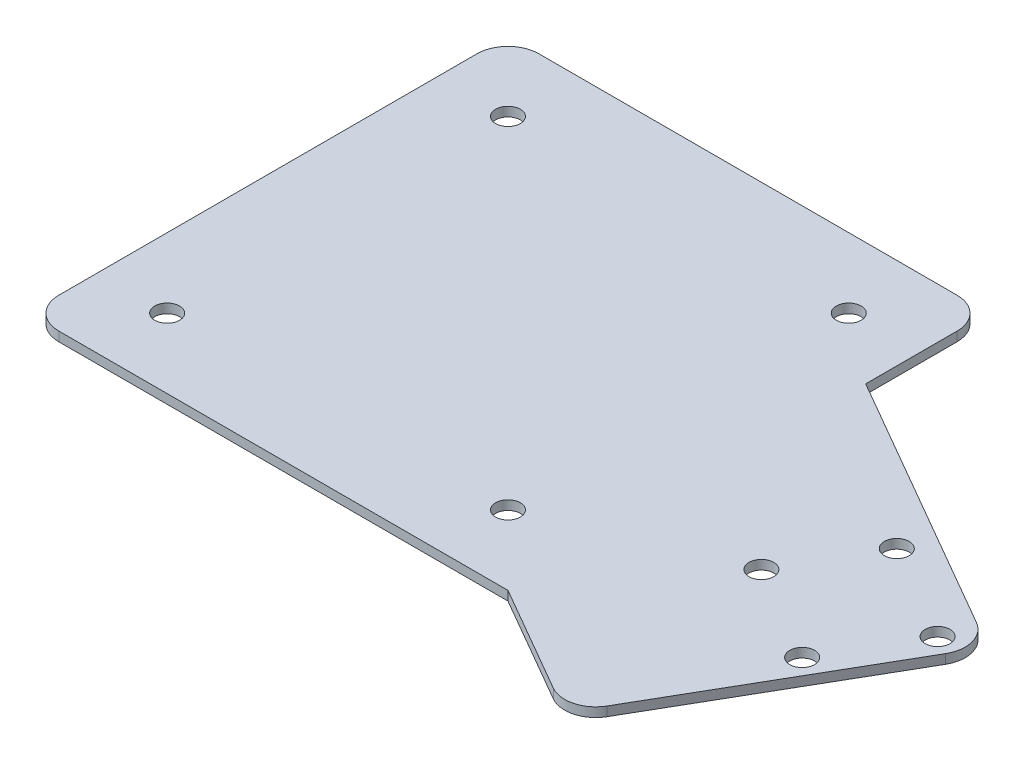
ISO-10303-21;
HEADER;
FILE_DESCRIPTION(('STEP AP214'),'2;1');
FILE_NAME('part.step','',(''),(''),'','','');
FILE_SCHEMA(('AUTOMOTIVE_DESIGN { 1 0 10303 214 1 1 1 1 }'));
ENDSEC;
DATA;
#1=APPLICATION_CONTEXT('core data for automotive mechanical design processes');
#2=APPLICATION_PROTOCOL_DEFINITION('international standard','automotive_design',2000,#1);
#3=PRODUCT_CONTEXT('',#1,'mechanical');
#4=PRODUCT('Part','Part','',(#3));
#5=PRODUCT_RELATED_PRODUCT_CATEGORY('part','',(#4));
#6=PRODUCT_DEFINITION_FORMATION('','',#4);
#7=PRODUCT_DEFINITION_CONTEXT('part definition',#1,'design');
#8=PRODUCT_DEFINITION('design','',#6,#7);
#9=PRODUCT_DEFINITION_SHAPE('','',#8);
#10=(LENGTH_UNIT() NAMED_UNIT(*) SI_UNIT(.MILLI.,.METRE.));
#11=(NAMED_UNIT(*) PLANE_ANGLE_UNIT() SI_UNIT($,.RADIAN.));
#12=(NAMED_UNIT(*) SI_UNIT($,.STERADIAN.) SOLID_ANGLE_UNIT());
#13=UNCERTAINTY_MEASURE_WITH_UNIT(LENGTH_MEASURE(1.E-05),#10,'distance_accuracy_value','');
#14=(GEOMETRIC_REPRESENTATION_CONTEXT(3) GLOBAL_UNCERTAINTY_ASSIGNED_CONTEXT((#13)) GLOBAL_UNIT_ASSIGNED_CONTEXT((#10,
#11,#12)) REPRESENTATION_CONTEXT('',''));
#15=CARTESIAN_POINT('',(0.,0.,0.));
#16=DIRECTION('',(0.,0.,1.));
#17=DIRECTION('',(1.,0.,0.));
#18=AXIS2_PLACEMENT_3D('',#15,#16,#17);
#19=CARTESIAN_POINT('',(0.,3.,0.));
#20=DIRECTION('',(0.,1.,0.));
#21=DIRECTION('',(0.,0.,1.));
#22=AXIS2_PLACEMENT_3D('',#19,#20,#21);
#23=PLANE('',#22);
#24=CARTESIAN_POINT('',(128.56217782649,3.,3.05771365939984));
#25=DIRECTION('',(0.,1.,0.));
#26=DIRECTION('',(0.,0.,-1.));
#27=AXIS2_PLACEMENT_3D('',#24,#25,#26);
#28=CIRCLE('',#27,3.99999999999999);
#29=CARTESIAN_POINT('',(128.56217782649,3.,-0.94228634060015));
#30=VERTEX_POINT('',#29);
#31=EDGE_CURVE('E316',#30,#30,#28,.T.);
#32=ORIENTED_EDGE('',*,*,#31,.F.);
#33=EDGE_LOOP('',(#32));
#34=FACE_BOUND('',#33,.T.);
#35=CARTESIAN_POINT('',(-55.,3.,55.));
#36=DIRECTION('',(0.,1.,0.));
#37=DIRECTION('',(0.,0.,1.));
#38=AXIS2_PLACEMENT_3D('',#35,#36,#37);
#39=CIRCLE('',#38,4.);
#40=CARTESIAN_POINT('',(-55.,3.,59.));
#41=VERTEX_POINT('',#40);
#42=EDGE_CURVE('E300',#41,#41,#39,.T.);
#43=ORIENTED_EDGE('',*,*,#42,.F.);
#44=EDGE_LOOP('',(#43));
#45=FACE_BOUND('',#44,.T.);
#46=CARTESIAN_POINT('',(55.,3.,-55.));
#47=DIRECTION('',(0.,1.,0.));
#48=DIRECTION('',(0.,0.,1.));
#49=AXIS2_PLACEMENT_3D('',#46,#47,#48);
#50=CIRCLE('',#49,3.99999999999999);
#51=CARTESIAN_POINT('',(55.,3.,-51.));
#52=VERTEX_POINT('',#51);
#53=EDGE_CURVE('E284',#52,#52,#50,.T.);
#54=ORIENTED_EDGE('',*,*,#53,.F.);
#55=EDGE_LOOP('',(#54));
#56=FACE_BOUND('',#55,.T.);
#57=CARTESIAN_POINT('',(-55.,3.,-55.));
#58=DIRECTION('',(0.,1.,0.));
#59=DIRECTION('',(0.,0.,1.));
#60=AXIS2_PLACEMENT_3D('',#57,#58,#59);
#61=CIRCLE('',#60,4.);
#62=CARTESIAN_POINT('',(-55.,3.,-51.));
#63=VERTEX_POINT('',#62);
#64=EDGE_CURVE('E180',#63,#63,#61,.T.);
#65=ORIENTED_EDGE('',*,*,#64,.F.);
#66=EDGE_LOOP('',(#65));
#67=FACE_BOUND('',#66,.T.);
#68=DIRECTION('',(0.866025403784442,0.,0.499999999999994));
#69=VECTOR('',#68,1.);
#70=CARTESIAN_POINT('',(77.5,3.,77.5));
#71=LINE('',#70,#69);
#72=CARTESIAN_POINT('',(77.5,3.,77.5));
#73=VERTEX_POINT('',#72);
#74=CARTESIAN_POINT('',(112.141016151378,3.,97.4999999999998));
#75=VERTEX_POINT('',#74);
#76=EDGE_CURVE('E134',#73,#75,#71,.T.);
#77=ORIENTED_EDGE('',*,*,#76,.T.);
#78=CARTESIAN_POINT('',(117.141016151378,3.,88.8397459621553));
#79=DIRECTION('',(0.,1.,0.));
#80=DIRECTION('',(0.,0.,1.));
#81=AXIS2_PLACEMENT_3D('',#78,#79,#80);
#82=CIRCLE('',#81,10.);
#83=CARTESIAN_POINT('',(125.801270189222,3.,93.8397459621553));
#84=VERTEX_POINT('',#83);
#85=EDGE_CURVE('E236',#75,#84,#82,.T.);
#86=ORIENTED_EDGE('',*,*,#85,.T.);
#87=DIRECTION('',(0.499999999999994,0.,-0.866025403784442));
#88=VECTOR('',#87,1.);
#89=CARTESIAN_POINT('',(120.801270189222,3.,102.5));
#90=LINE('',#89,#88);
#91=CARTESIAN_POINT('',(165.801270189222,3.,24.5577136593999));
#92=VERTEX_POINT('',#91);
#93=EDGE_CURVE('E160',#84,#92,#90,.T.);
#94=ORIENTED_EDGE('',*,*,#93,.T.);
#95=CARTESIAN_POINT('',(157.141016151377,3.,19.5577136594));
#96=DIRECTION('',(0.,1.,0.));
#97=DIRECTION('',(0.,0.,1.));
#98=AXIS2_PLACEMENT_3D('',#95,#96,#97);
#99=CIRCLE('',#98,10.);
#100=CARTESIAN_POINT('',(162.141016151377,3.,10.8974596215556));
#101=VERTEX_POINT('',#100);
#102=EDGE_CURVE('E233',#92,#101,#99,.T.);
#103=ORIENTED_EDGE('',*,*,#102,.T.);
#104=DIRECTION('',(-0.866025403784442,0.,-0.499999999999994));
#105=VECTOR('',#104,1.);
#106=CARTESIAN_POINT('',(170.801270189221,3.,15.8974596215555));
#107=LINE('',#106,#105);
#108=CARTESIAN_POINT('',(77.5,3.,-37.9700538379247));
#109=VERTEX_POINT('',#108);
#110=EDGE_CURVE('E164',#101,#109,#107,.T.);
#111=ORIENTED_EDGE('',*,*,#110,.T.);
#112=DIRECTION('',(0.,0.,-1.));
#113=VECTOR('',#112,1.);
#114=CARTESIAN_POINT('',(77.5,3.,-37.9700538379247));
#115=LINE('',#114,#113);
#116=CARTESIAN_POINT('',(77.5,3.,-67.5));
#117=VERTEX_POINT('',#116);
#118=EDGE_CURVE('E170',#109,#117,#115,.T.);
#119=ORIENTED_EDGE('',*,*,#118,.T.);
#120=CARTESIAN_POINT('',(67.5,3.,-67.5));
#121=DIRECTION('',(0.,1.,0.));
#122=DIRECTION('',(0.,0.,1.));
#123=AXIS2_PLACEMENT_3D('',#120,#121,#122);
#124=CIRCLE('',#123,10.);
#125=CARTESIAN_POINT('',(67.5,3.,-77.5));
#126=VERTEX_POINT('',#125);
#127=EDGE_CURVE('E62',#117,#126,#124,.T.);
#128=ORIENTED_EDGE('',*,*,#127,.T.);
#129=DIRECTION('',(-1.,0.,0.));
#130=VECTOR('',#129,1.);
#131=CARTESIAN_POINT('',(77.5,3.,-77.5));
#132=LINE('',#131,#130);
#133=CARTESIAN_POINT('',(-67.5,3.,-77.5));
#134=VERTEX_POINT('',#133);
#135=EDGE_CURVE('E173',#126,#134,#132,.T.);
#136=ORIENTED_EDGE('',*,*,#135,.T.);
#137=CARTESIAN_POINT('',(-67.5,3.,-67.5));
#138=DIRECTION('',(0.,1.,0.));
#139=DIRECTION('',(0.,0.,1.));
#140=AXIS2_PLACEMENT_3D('',#137,#138,#139);
#141=CIRCLE('',#140,10.);
#142=CARTESIAN_POINT('',(-77.5,3.,-67.5));
#143=VERTEX_POINT('',#142);
#144=EDGE_CURVE('E228',#134,#143,#141,.T.);
#145=ORIENTED_EDGE('',*,*,#144,.T.);
#146=DIRECTION('',(0.,0.,1.));
#147=VECTOR('',#146,1.);
#148=CARTESIAN_POINT('',(-77.5,3.,77.5));
#149=LINE('',#148,#147);
#150=CARTESIAN_POINT('',(-77.5,3.,67.5));
#151=VERTEX_POINT('',#150);
#152=EDGE_CURVE('E142',#143,#151,#149,.T.);
#153=ORIENTED_EDGE('',*,*,#152,.T.);
#154=CARTESIAN_POINT('',(-67.5,3.,67.5));
#155=DIRECTION('',(0.,1.,0.));
#156=DIRECTION('',(0.,0.,1.));
#157=AXIS2_PLACEMENT_3D('',#154,#155,#156);
#158=CIRCLE('',#157,10.);
#159=CARTESIAN_POINT('',(-67.5,3.,77.5));
#160=VERTEX_POINT('',#159);
#161=EDGE_CURVE('E138',#151,#160,#158,.T.);
#162=ORIENTED_EDGE('',*,*,#161,.T.);
#163=DIRECTION('',(1.,0.,0.));
#164=VECTOR('',#163,1.);
#165=CARTESIAN_POINT('',(77.5,3.,77.5));
#166=LINE('',#165,#164);
#167=EDGE_CURVE('E130',#160,#73,#166,.T.);
#168=ORIENTED_EDGE('',*,*,#167,.T.);
#169=EDGE_LOOP('',(#77,#86,#94,#103,#111,#119,#128,#136,#145,#153,#162,#168));
#170=FACE_BOUND('',#169,.T.);
#171=CARTESIAN_POINT('',(159.739092362731,3.,21.0577136594003));
#172=DIRECTION('',(0.,1.,0.));
#173=DIRECTION('',(0.,0.,1.));
#174=AXIS2_PLACEMENT_3D('',#171,#172,#173);
#175=CIRCLE('',#174,4.00000000000002);
#176=CARTESIAN_POINT('',(159.739092362731,3.,25.0577136594003));
#177=VERTEX_POINT('',#176);
#178=EDGE_CURVE('E276',#177,#177,#175,.T.);
#179=ORIENTED_EDGE('',*,*,#178,.F.);
#180=EDGE_LOOP('',(#179));
#181=FACE_BOUND('',#180,.T.);
#182=CARTESIAN_POINT('',(55.,3.,55.));
#183=DIRECTION('',(0.,1.,0.));
#184=DIRECTION('',(0.,0.,1.));
#185=AXIS2_PLACEMENT_3D('',#182,#183,#184);
#186=CIRCLE('',#185,4.00000000000001);
#187=CARTESIAN_POINT('',(55.,3.,59.));
#188=VERTEX_POINT('',#187);
#189=EDGE_CURVE('E292',#188,#188,#186,.T.);
#190=ORIENTED_EDGE('',*,*,#189,.F.);
#191=EDGE_LOOP('',(#190));
#192=FACE_BOUND('',#191,.T.);
#193=CARTESIAN_POINT('',(143.739092362731,3.,48.7705265805025));
#194=DIRECTION('',(0.,1.,0.));
#195=DIRECTION('',(0.,0.,1.));
#196=AXIS2_PLACEMENT_3D('',#193,#194,#195);
#197=CIRCLE('',#196,4.00000000000004);
#198=CARTESIAN_POINT('',(143.739092362731,3.,52.7705265805025));
#199=VERTEX_POINT('',#198);
#200=EDGE_CURVE('E308',#199,#199,#197,.T.);
#201=ORIENTED_EDGE('',*,*,#200,.F.);
#202=EDGE_LOOP('',(#201));
#203=FACE_BOUND('',#202,.T.);
#204=CARTESIAN_POINT('',(112.56217782649,3.,30.770526580502));
#205=DIRECTION('',(0.,1.,0.));
#206=DIRECTION('',(0.,0.,-1.));
#207=AXIS2_PLACEMENT_3D('',#204,#205,#206);
#208=CIRCLE('',#207,4.00000000000002);
#209=CARTESIAN_POINT('',(112.56217782649,3.,26.770526580502));
#210=VERTEX_POINT('',#209);
#211=EDGE_CURVE('E324',#210,#210,#208,.T.);
#212=ORIENTED_EDGE('',*,*,#211,.F.);
#213=EDGE_LOOP('',(#212));
#214=FACE_BOUND('',#213,.T.);
#215=ADVANCED_FACE('F39',(#34,#45,#56,#67,#170,#181,#192,#203,#214),#23,.T.);
#216=CARTESIAN_POINT('',(0.,0.,0.));
#217=DIRECTION('',(0.,1.,0.));
#218=DIRECTION('',(0.,0.,1.));
#219=AXIS2_PLACEMENT_3D('',#216,#217,#218);
#220=PLANE('',#219);
#221=DIRECTION('',(0.499999999999994,0.,-0.866025403784442));
#222=VECTOR('',#221,1.);
#223=CARTESIAN_POINT('',(120.801270189222,0.,102.5));
#224=LINE('',#223,#222);
#225=CARTESIAN_POINT('',(125.801270189222,0.,93.8397459621553));
#226=VERTEX_POINT('',#225);
#227=CARTESIAN_POINT('',(165.801270189222,0.,24.5577136593999));
#228=VERTEX_POINT('',#227);
#229=EDGE_CURVE('E186',#226,#228,#224,.T.);
#230=ORIENTED_EDGE('',*,*,#229,.F.);
#231=CARTESIAN_POINT('',(117.141016151378,0.,88.8397459621553));
#232=DIRECTION('',(0.,1.,0.));
#233=DIRECTION('',(0.,0.,1.));
#234=AXIS2_PLACEMENT_3D('',#231,#232,#233);
#235=CIRCLE('',#234,10.);
#236=CARTESIAN_POINT('',(112.141016151378,0.,97.4999999999998));
#237=VERTEX_POINT('',#236);
#238=EDGE_CURVE('E221',#226,#237,#235,.F.);
#239=ORIENTED_EDGE('',*,*,#238,.T.);
#240=DIRECTION('',(0.866025403784442,0.,0.499999999999994));
#241=VECTOR('',#240,1.);
#242=CARTESIAN_POINT('',(77.5,0.,77.5));
#243=LINE('',#242,#241);
#244=CARTESIAN_POINT('',(77.5,0.,77.5));
#245=VERTEX_POINT('',#244);
#246=EDGE_CURVE('E183',#245,#237,#243,.T.);
#247=ORIENTED_EDGE('',*,*,#246,.F.);
#248=DIRECTION('',(1.,0.,0.));
#249=VECTOR('',#248,1.);
#250=CARTESIAN_POINT('',(77.5,0.,77.5));
#251=LINE('',#250,#249);
#252=CARTESIAN_POINT('',(-67.5,0.,77.5));
#253=VERTEX_POINT('',#252);
#254=EDGE_CURVE('E148',#253,#245,#251,.T.);
#255=ORIENTED_EDGE('',*,*,#254,.F.);
#256=CARTESIAN_POINT('',(-67.5,0.,67.5));
#257=DIRECTION('',(0.,1.,0.));
#258=DIRECTION('',(0.,0.,1.));
#259=AXIS2_PLACEMENT_3D('',#256,#257,#258);
#260=CIRCLE('',#259,10.);
#261=CARTESIAN_POINT('',(-77.5,0.,67.5));
#262=VERTEX_POINT('',#261);
#263=EDGE_CURVE('E209',#253,#262,#260,.F.);
#264=ORIENTED_EDGE('',*,*,#263,.T.);
#265=DIRECTION('',(0.,0.,1.));
#266=VECTOR('',#265,1.);
#267=CARTESIAN_POINT('',(-77.5,0.,77.5));
#268=LINE('',#267,#266);
#269=CARTESIAN_POINT('',(-77.5,0.,-67.5));
#270=VERTEX_POINT('',#269);
#271=EDGE_CURVE('E176',#270,#262,#268,.T.);
#272=ORIENTED_EDGE('',*,*,#271,.F.);
#273=CARTESIAN_POINT('',(-67.5,0.,-67.5));
#274=DIRECTION('',(0.,1.,0.));
#275=DIRECTION('',(0.,0.,1.));
#276=AXIS2_PLACEMENT_3D('',#273,#274,#275);
#277=CIRCLE('',#276,10.);
#278=CARTESIAN_POINT('',(-67.5,0.,-77.5));
#279=VERTEX_POINT('',#278);
#280=EDGE_CURVE('E212',#270,#279,#277,.F.);
#281=ORIENTED_EDGE('',*,*,#280,.T.);
#282=DIRECTION('',(-1.,0.,0.));
#283=VECTOR('',#282,1.);
#284=CARTESIAN_POINT('',(77.5,0.,-77.5));
#285=LINE('',#284,#283);
#286=CARTESIAN_POINT('',(67.5,0.,-77.5));
#287=VERTEX_POINT('',#286);
#288=EDGE_CURVE('E197',#287,#279,#285,.T.);
#289=ORIENTED_EDGE('',*,*,#288,.F.);
#290=CARTESIAN_POINT('',(67.5,0.,-67.5));
#291=DIRECTION('',(0.,1.,0.));
#292=DIRECTION('',(0.,0.,1.));
#293=AXIS2_PLACEMENT_3D('',#290,#291,#292);
#294=CIRCLE('',#293,10.);
#295=CARTESIAN_POINT('',(77.5,0.,-67.5));
#296=VERTEX_POINT('',#295);
#297=EDGE_CURVE('E215',#287,#296,#294,.F.);
#298=ORIENTED_EDGE('',*,*,#297,.T.);
#299=DIRECTION('',(0.,0.,-1.));
#300=VECTOR('',#299,1.);
#301=CARTESIAN_POINT('',(77.5,0.,-37.9700538379247));
#302=LINE('',#301,#300);
#303=CARTESIAN_POINT('',(77.5,0.,-37.9700538379247));
#304=VERTEX_POINT('',#303);
#305=EDGE_CURVE('E193',#304,#296,#302,.T.);
#306=ORIENTED_EDGE('',*,*,#305,.F.);
#307=DIRECTION('',(-0.866025403784442,0.,-0.499999999999994));
#308=VECTOR('',#307,1.);
#309=CARTESIAN_POINT('',(170.801270189221,0.,15.8974596215555));
#310=LINE('',#309,#308);
#311=CARTESIAN_POINT('',(162.141016151377,0.,10.8974596215556));
#312=VERTEX_POINT('',#311);
#313=EDGE_CURVE('E190',#312,#304,#310,.T.);
#314=ORIENTED_EDGE('',*,*,#313,.F.);
#315=CARTESIAN_POINT('',(157.141016151377,0.,19.5577136594));
#316=DIRECTION('',(0.,1.,0.));
#317=DIRECTION('',(0.,0.,1.));
#318=AXIS2_PLACEMENT_3D('',#315,#316,#317);
#319=CIRCLE('',#318,10.);
#320=EDGE_CURVE('E218',#312,#228,#319,.F.);
#321=ORIENTED_EDGE('',*,*,#320,.T.);
#322=EDGE_LOOP('',(#230,#239,#247,#255,#264,#272,#281,#289,#298,#306,#314,#321));
#323=FACE_BOUND('',#322,.T.);
#324=CARTESIAN_POINT('',(-55.,0.,-55.));
#325=DIRECTION('',(0.,1.,0.));
#326=DIRECTION('',(0.,0.,1.));
#327=AXIS2_PLACEMENT_3D('',#324,#325,#326);
#328=CIRCLE('',#327,4.);
#329=CARTESIAN_POINT('',(-55.,0.,-51.));
#330=VERTEX_POINT('',#329);
#331=EDGE_CURVE('E272',#330,#330,#328,.T.);
#332=ORIENTED_EDGE('',*,*,#331,.T.);
#333=EDGE_LOOP('',(#332));
#334=FACE_BOUND('',#333,.T.);
#335=CARTESIAN_POINT('',(159.739092362731,0.,21.0577136594003));
#336=DIRECTION('',(0.,1.,0.));
#337=DIRECTION('',(0.,0.,1.));
#338=AXIS2_PLACEMENT_3D('',#335,#336,#337);
#339=CIRCLE('',#338,4.00000000000002);
#340=CARTESIAN_POINT('',(159.739092362731,0.,25.0577136594003));
#341=VERTEX_POINT('',#340);
#342=EDGE_CURVE('E280',#341,#341,#339,.T.);
#343=ORIENTED_EDGE('',*,*,#342,.T.);
#344=EDGE_LOOP('',(#343));
#345=FACE_BOUND('',#344,.T.);
#346=CARTESIAN_POINT('',(55.,0.,-55.));
#347=DIRECTION('',(0.,1.,0.));
#348=DIRECTION('',(0.,0.,1.));
#349=AXIS2_PLACEMENT_3D('',#346,#347,#348);
#350=CIRCLE('',#349,3.99999999999999);
#351=CARTESIAN_POINT('',(55.,0.,-51.));
#352=VERTEX_POINT('',#351);
#353=EDGE_CURVE('E288',#352,#352,#350,.T.);
#354=ORIENTED_EDGE('',*,*,#353,.T.);
#355=EDGE_LOOP('',(#354));
#356=FACE_BOUND('',#355,.T.);
#357=CARTESIAN_POINT('',(55.,0.,55.));
#358=DIRECTION('',(0.,1.,0.));
#359=DIRECTION('',(0.,0.,1.));
#360=AXIS2_PLACEMENT_3D('',#357,#358,#359);
#361=CIRCLE('',#360,4.00000000000001);
#362=CARTESIAN_POINT('',(55.,0.,59.));
#363=VERTEX_POINT('',#362);
#364=EDGE_CURVE('E296',#363,#363,#361,.T.);
#365=ORIENTED_EDGE('',*,*,#364,.T.);
#366=EDGE_LOOP('',(#365));
#367=FACE_BOUND('',#366,.T.);
#368=CARTESIAN_POINT('',(-55.,0.,55.));
#369=DIRECTION('',(0.,1.,0.));
#370=DIRECTION('',(0.,0.,1.));
#371=AXIS2_PLACEMENT_3D('',#368,#369,#370);
#372=CIRCLE('',#371,4.);
#373=CARTESIAN_POINT('',(-55.,0.,59.));
#374=VERTEX_POINT('',#373);
#375=EDGE_CURVE('E304',#374,#374,#372,.T.);
#376=ORIENTED_EDGE('',*,*,#375,.T.);
#377=EDGE_LOOP('',(#376));
#378=FACE_BOUND('',#377,.T.);
#379=CARTESIAN_POINT('',(143.739092362731,0.,48.7705265805025));
#380=DIRECTION('',(0.,1.,0.));
#381=DIRECTION('',(0.,0.,1.));
#382=AXIS2_PLACEMENT_3D('',#379,#380,#381);
#383=CIRCLE('',#382,4.00000000000004);
#384=CARTESIAN_POINT('',(143.739092362731,0.,52.7705265805025));
#385=VERTEX_POINT('',#384);
#386=EDGE_CURVE('E312',#385,#385,#383,.T.);
#387=ORIENTED_EDGE('',*,*,#386,.T.);
#388=EDGE_LOOP('',(#387));
#389=FACE_BOUND('',#388,.T.);
#390=CARTESIAN_POINT('',(128.56217782649,0.,3.05771365939984));
#391=DIRECTION('',(0.,1.,0.));
#392=DIRECTION('',(0.,0.,-1.));
#393=AXIS2_PLACEMENT_3D('',#390,#391,#392);
#394=CIRCLE('',#393,3.99999999999999);
#395=CARTESIAN_POINT('',(128.56217782649,0.,-0.94228634060015));
#396=VERTEX_POINT('',#395);
#397=EDGE_CURVE('E320',#396,#396,#394,.T.);
#398=ORIENTED_EDGE('',*,*,#397,.T.);
#399=EDGE_LOOP('',(#398));
#400=FACE_BOUND('',#399,.T.);
#401=CARTESIAN_POINT('',(112.56217782649,0.,30.770526580502));
#402=DIRECTION('',(0.,1.,0.));
#403=DIRECTION('',(0.,0.,-1.));
#404=AXIS2_PLACEMENT_3D('',#401,#402,#403);
#405=CIRCLE('',#404,4.00000000000002);
#406=CARTESIAN_POINT('',(112.56217782649,0.,26.770526580502));
#407=VERTEX_POINT('',#406);
#408=EDGE_CURVE('E328',#407,#407,#405,.T.);
#409=ORIENTED_EDGE('',*,*,#408,.T.);
#410=EDGE_LOOP('',(#409));
#411=FACE_BOUND('',#410,.T.);
#412=ADVANCED_FACE('F266',(#323,#334,#345,#356,#367,#378,#389,#400,#411),#220,.F.);
#413=CARTESIAN_POINT('',(-77.5,3.,77.5));
#414=DIRECTION('',(1.,0.,0.));
#415=DIRECTION('',(0.,0.,-1.));
#416=AXIS2_PLACEMENT_3D('',#413,#414,#415);
#417=PLANE('',#416);
#418=ORIENTED_EDGE('',*,*,#152,.F.);
#419=DIRECTION('',(0.,-1.,0.));
#420=VECTOR('',#419,1.);
#421=CARTESIAN_POINT('',(-77.5,3.,-67.5));
#422=LINE('',#421,#420);
#423=EDGE_CURVE('E48',#143,#270,#422,.T.);
#424=ORIENTED_EDGE('',*,*,#423,.T.);
#425=ORIENTED_EDGE('',*,*,#271,.T.);
#426=DIRECTION('',(0.,-1.,0.));
#427=VECTOR('',#426,1.);
#428=CARTESIAN_POINT('',(-77.5,3.,67.5));
#429=LINE('',#428,#427);
#430=EDGE_CURVE('E252',#262,#151,#429,.F.);
#431=ORIENTED_EDGE('',*,*,#430,.T.);
#432=EDGE_LOOP('',(#418,#424,#425,#431));
#433=FACE_BOUND('',#432,.T.);
#434=ADVANCED_FACE('F260',(#433),#417,.F.);
#435=CARTESIAN_POINT('',(77.5,3.,77.5));
#436=DIRECTION('',(0.,0.,-1.));
#437=DIRECTION('',(-1.,0.,0.));
#438=AXIS2_PLACEMENT_3D('',#435,#436,#437);
#439=PLANE('',#438);
#440=ORIENTED_EDGE('',*,*,#167,.F.);
#441=DIRECTION('',(0.,-1.,0.));
#442=VECTOR('',#441,1.);
#443=CARTESIAN_POINT('',(-67.5,3.,77.5));
#444=LINE('',#443,#442);
#445=EDGE_CURVE('E11',#160,#253,#444,.T.);
#446=ORIENTED_EDGE('',*,*,#445,.T.);
#447=ORIENTED_EDGE('',*,*,#254,.T.);
#448=DIRECTION('',(0.,-1.,0.));
#449=VECTOR('',#448,1.);
#450=CARTESIAN_POINT('',(77.5,3.,77.5));
#451=LINE('',#450,#449);
#452=EDGE_CURVE('E145',#73,#245,#451,.T.);
#453=ORIENTED_EDGE('',*,*,#452,.F.);
#454=EDGE_LOOP('',(#440,#446,#447,#453));
#455=FACE_BOUND('',#454,.T.);
#456=ADVANCED_FACE('F146',(#455),#439,.F.);
#457=CARTESIAN_POINT('',(77.5,3.,77.5));
#458=DIRECTION('',(0.499999999999994,0.,-0.866025403784442));
#459=DIRECTION('',(-0.866025403784442,0.,-0.499999999999994));
#460=AXIS2_PLACEMENT_3D('',#457,#458,#459);
#461=PLANE('',#460);
#462=ORIENTED_EDGE('',*,*,#246,.T.);
#463=DIRECTION('',(0.,-1.,0.));
#464=VECTOR('',#463,1.);
#465=CARTESIAN_POINT('',(112.141016151378,3.,97.4999999999998));
#466=LINE('',#465,#464);
#467=EDGE_CURVE('E158',#237,#75,#466,.F.);
#468=ORIENTED_EDGE('',*,*,#467,.T.);
#469=ORIENTED_EDGE('',*,*,#76,.F.);
#470=ORIENTED_EDGE('',*,*,#452,.T.);
#471=EDGE_LOOP('',(#462,#468,#469,#470));
#472=FACE_BOUND('',#471,.T.);
#473=ADVANCED_FACE('F156',(#472),#461,.F.);
#474=CARTESIAN_POINT('',(120.801270189222,3.,102.5));
#475=DIRECTION('',(-0.866025403784442,0.,-0.499999999999994));
#476=DIRECTION('',(-0.499999999999994,0.,0.866025403784442));
#477=AXIS2_PLACEMENT_3D('',#474,#475,#476);
#478=PLANE('',#477);
#479=ORIENTED_EDGE('',*,*,#93,.F.);
#480=DIRECTION('',(0.,-1.,0.));
#481=VECTOR('',#480,1.);
#482=CARTESIAN_POINT('',(125.801270189222,3.,93.8397459621553));
#483=LINE('',#482,#481);
#484=EDGE_CURVE('E205',#84,#226,#483,.T.);
#485=ORIENTED_EDGE('',*,*,#484,.T.);
#486=ORIENTED_EDGE('',*,*,#229,.T.);
#487=DIRECTION('',(0.,-1.,0.));
#488=VECTOR('',#487,1.);
#489=CARTESIAN_POINT('',(165.801270189222,3.,24.5577136593999));
#490=LINE('',#489,#488);
#491=EDGE_CURVE('E153',#228,#92,#490,.F.);
#492=ORIENTED_EDGE('',*,*,#491,.T.);
#493=EDGE_LOOP('',(#479,#485,#486,#492));
#494=FACE_BOUND('',#493,.T.);
#495=ADVANCED_FACE('F362',(#494),#478,.F.);
#496=CARTESIAN_POINT('',(170.801270189221,3.,15.8974596215555));
#497=DIRECTION('',(-0.499999999999994,0.,0.866025403784442));
#498=DIRECTION('',(0.866025403784442,0.,0.499999999999994));
#499=AXIS2_PLACEMENT_3D('',#496,#497,#498);
#500=PLANE('',#499);
#501=ORIENTED_EDGE('',*,*,#110,.F.);
#502=DIRECTION('',(0.,-1.,0.));
#503=VECTOR('',#502,1.);
#504=CARTESIAN_POINT('',(162.141016151377,3.,10.8974596215556));
#505=LINE('',#504,#503);
#506=EDGE_CURVE('E239',#101,#312,#505,.T.);
#507=ORIENTED_EDGE('',*,*,#506,.T.);
#508=ORIENTED_EDGE('',*,*,#313,.T.);
#509=DIRECTION('',(0.,-1.,0.));
#510=VECTOR('',#509,1.);
#511=CARTESIAN_POINT('',(77.5,3.,-37.9700538379247));
#512=LINE('',#511,#510);
#513=EDGE_CURVE('E154',#109,#304,#512,.T.);
#514=ORIENTED_EDGE('',*,*,#513,.F.);
#515=EDGE_LOOP('',(#501,#507,#508,#514));
#516=FACE_BOUND('',#515,.T.);
#517=ADVANCED_FACE('F358',(#516),#500,.F.);
#518=CARTESIAN_POINT('',(77.5,3.,-37.9700538379247));
#519=DIRECTION('',(-1.,0.,0.));
#520=DIRECTION('',(0.,0.,1.));
#521=AXIS2_PLACEMENT_3D('',#518,#519,#520);
#522=PLANE('',#521);
#523=ORIENTED_EDGE('',*,*,#305,.T.);
#524=DIRECTION('',(0.,-1.,0.));
#525=VECTOR('',#524,1.);
#526=CARTESIAN_POINT('',(77.5,3.,-67.5));
#527=LINE('',#526,#525);
#528=EDGE_CURVE('E249',#296,#117,#527,.F.);
#529=ORIENTED_EDGE('',*,*,#528,.T.);
#530=ORIENTED_EDGE('',*,*,#118,.F.);
#531=ORIENTED_EDGE('',*,*,#513,.T.);
#532=EDGE_LOOP('',(#523,#529,#530,#531));
#533=FACE_BOUND('',#532,.T.);
#534=ADVANCED_FACE('F355',(#533),#522,.F.);
#535=CARTESIAN_POINT('',(77.5,3.,-77.5));
#536=DIRECTION('',(0.,0.,1.));
#537=DIRECTION('',(1.,0.,0.));
#538=AXIS2_PLACEMENT_3D('',#535,#536,#537);
#539=PLANE('',#538);
#540=ORIENTED_EDGE('',*,*,#135,.F.);
#541=DIRECTION('',(0.,-1.,0.));
#542=VECTOR('',#541,1.);
#543=CARTESIAN_POINT('',(67.5,3.,-77.5));
#544=LINE('',#543,#542);
#545=EDGE_CURVE('E245',#126,#287,#544,.T.);
#546=ORIENTED_EDGE('',*,*,#545,.T.);
#547=ORIENTED_EDGE('',*,*,#288,.T.);
#548=DIRECTION('',(0.,-1.,0.));
#549=VECTOR('',#548,1.);
#550=CARTESIAN_POINT('',(-67.5,3.,-77.5));
#551=LINE('',#550,#549);
#552=EDGE_CURVE('E55',#279,#134,#551,.F.);
#553=ORIENTED_EDGE('',*,*,#552,.T.);
#554=EDGE_LOOP('',(#540,#546,#547,#553));
#555=FACE_BOUND('',#554,.T.);
#556=ADVANCED_FACE('F352',(#555),#539,.F.);
#557=CARTESIAN_POINT('',(-55.,3.,-55.));
#558=DIRECTION('',(0.,-1.,0.));
#559=DIRECTION('',(0.,0.,-1.));
#560=AXIS2_PLACEMENT_3D('',#557,#558,#559);
#561=CYLINDRICAL_SURFACE('',#560,4.);
#562=ORIENTED_EDGE('',*,*,#64,.T.);
#563=EDGE_LOOP('',(#562));
#564=FACE_BOUND('',#563,.T.);
#565=ORIENTED_EDGE('',*,*,#331,.F.);
#566=EDGE_LOOP('',(#565));
#567=FACE_BOUND('',#566,.T.);
#568=ADVANCED_FACE('F349',(#564,#567),#561,.F.);
#569=CARTESIAN_POINT('',(159.739092362731,3.,21.0577136594003));
#570=DIRECTION('',(0.,-1.,0.));
#571=DIRECTION('',(0.,0.,-1.));
#572=AXIS2_PLACEMENT_3D('',#569,#570,#571);
#573=CYLINDRICAL_SURFACE('',#572,4.00000000000002);
#574=ORIENTED_EDGE('',*,*,#178,.T.);
#575=EDGE_LOOP('',(#574));
#576=FACE_BOUND('',#575,.T.);
#577=ORIENTED_EDGE('',*,*,#342,.F.);
#578=EDGE_LOOP('',(#577));
#579=FACE_BOUND('',#578,.T.);
#580=ADVANCED_FACE('F525',(#576,#579),#573,.F.);
#581=CARTESIAN_POINT('',(55.,3.,-55.));
#582=DIRECTION('',(0.,-1.,0.));
#583=DIRECTION('',(0.,0.,-1.));
#584=AXIS2_PLACEMENT_3D('',#581,#582,#583);
#585=CYLINDRICAL_SURFACE('',#584,3.99999999999999);
#586=ORIENTED_EDGE('',*,*,#53,.T.);
#587=EDGE_LOOP('',(#586));
#588=FACE_BOUND('',#587,.T.);
#589=ORIENTED_EDGE('',*,*,#353,.F.);
#590=EDGE_LOOP('',(#589));
#591=FACE_BOUND('',#590,.T.);
#592=ADVANCED_FACE('F515',(#588,#591),#585,.F.);
#593=CARTESIAN_POINT('',(55.,3.,55.));
#594=DIRECTION('',(0.,-1.,0.));
#595=DIRECTION('',(0.,0.,-1.));
#596=AXIS2_PLACEMENT_3D('',#593,#594,#595);
#597=CYLINDRICAL_SURFACE('',#596,4.00000000000001);
#598=ORIENTED_EDGE('',*,*,#189,.T.);
#599=EDGE_LOOP('',(#598));
#600=FACE_BOUND('',#599,.T.);
#601=ORIENTED_EDGE('',*,*,#364,.F.);
#602=EDGE_LOOP('',(#601));
#603=FACE_BOUND('',#602,.T.);
#604=ADVANCED_FACE('F505',(#600,#603),#597,.F.);
#605=CARTESIAN_POINT('',(-55.,3.,55.));
#606=DIRECTION('',(0.,-1.,0.));
#607=DIRECTION('',(0.,0.,-1.));
#608=AXIS2_PLACEMENT_3D('',#605,#606,#607);
#609=CYLINDRICAL_SURFACE('',#608,4.);
#610=ORIENTED_EDGE('',*,*,#42,.T.);
#611=EDGE_LOOP('',(#610));
#612=FACE_BOUND('',#611,.T.);
#613=ORIENTED_EDGE('',*,*,#375,.F.);
#614=EDGE_LOOP('',(#613));
#615=FACE_BOUND('',#614,.T.);
#616=ADVANCED_FACE('F495',(#612,#615),#609,.F.);
#617=CARTESIAN_POINT('',(143.739092362731,3.,48.7705265805025));
#618=DIRECTION('',(0.,-1.,0.));
#619=DIRECTION('',(0.,0.,-1.));
#620=AXIS2_PLACEMENT_3D('',#617,#618,#619);
#621=CYLINDRICAL_SURFACE('',#620,4.00000000000004);
#622=ORIENTED_EDGE('',*,*,#200,.T.);
#623=EDGE_LOOP('',(#622));
#624=FACE_BOUND('',#623,.T.);
#625=ORIENTED_EDGE('',*,*,#386,.F.);
#626=EDGE_LOOP('',(#625));
#627=FACE_BOUND('',#626,.T.);
#628=ADVANCED_FACE('F485',(#624,#627),#621,.F.);
#629=CARTESIAN_POINT('',(128.56217782649,3.,3.05771365939984));
#630=DIRECTION('',(0.,-1.,0.));
#631=DIRECTION('',(0.,0.,-1.));
#632=AXIS2_PLACEMENT_3D('',#629,#630,#631);
#633=CYLINDRICAL_SURFACE('',#632,3.99999999999999);
#634=ORIENTED_EDGE('',*,*,#31,.T.);
#635=EDGE_LOOP('',(#634));
#636=FACE_BOUND('',#635,.T.);
#637=ORIENTED_EDGE('',*,*,#397,.F.);
#638=EDGE_LOOP('',(#637));
#639=FACE_BOUND('',#638,.T.);
#640=ADVANCED_FACE('F476',(#636,#639),#633,.F.);
#641=CARTESIAN_POINT('',(112.56217782649,3.,30.770526580502));
#642=DIRECTION('',(0.,-1.,0.));
#643=DIRECTION('',(0.,0.,-1.));
#644=AXIS2_PLACEMENT_3D('',#641,#642,#643);
#645=CYLINDRICAL_SURFACE('',#644,4.00000000000002);
#646=ORIENTED_EDGE('',*,*,#211,.T.);
#647=EDGE_LOOP('',(#646));
#648=FACE_BOUND('',#647,.T.);
#649=ORIENTED_EDGE('',*,*,#408,.F.);
#650=EDGE_LOOP('',(#649));
#651=FACE_BOUND('',#650,.T.);
#652=ADVANCED_FACE('F336',(#648,#651),#645,.F.);
#653=CARTESIAN_POINT('',(117.141016151378,3.,88.8397459621553));
#654=DIRECTION('',(0.,-1.,0.));
#655=DIRECTION('',(0.,0.,-1.));
#656=AXIS2_PLACEMENT_3D('',#653,#654,#655);
#657=CYLINDRICAL_SURFACE('',#656,10.);
#658=ORIENTED_EDGE('',*,*,#85,.F.);
#659=ORIENTED_EDGE('',*,*,#467,.F.);
#660=ORIENTED_EDGE('',*,*,#238,.F.);
#661=ORIENTED_EDGE('',*,*,#484,.F.);
#662=EDGE_LOOP('',(#658,#659,#660,#661));
#663=FACE_BOUND('',#662,.T.);
#664=ADVANCED_FACE('F373',(#663),#657,.T.);
#665=CARTESIAN_POINT('',(157.141016151377,3.,19.5577136594));
#666=DIRECTION('',(0.,-1.,0.));
#667=DIRECTION('',(0.,0.,-1.));
#668=AXIS2_PLACEMENT_3D('',#665,#666,#667);
#669=CYLINDRICAL_SURFACE('',#668,10.);
#670=ORIENTED_EDGE('',*,*,#102,.F.);
#671=ORIENTED_EDGE('',*,*,#491,.F.);
#672=ORIENTED_EDGE('',*,*,#320,.F.);
#673=ORIENTED_EDGE('',*,*,#506,.F.);
#674=EDGE_LOOP('',(#670,#671,#672,#673));
#675=FACE_BOUND('',#674,.T.);
#676=ADVANCED_FACE('F376',(#675),#669,.T.);
#677=CARTESIAN_POINT('',(67.5,3.,-67.5));
#678=DIRECTION('',(0.,-1.,0.));
#679=DIRECTION('',(0.,0.,-1.));
#680=AXIS2_PLACEMENT_3D('',#677,#678,#679);
#681=CYLINDRICAL_SURFACE('',#680,10.);
#682=ORIENTED_EDGE('',*,*,#127,.F.);
#683=ORIENTED_EDGE('',*,*,#528,.F.);
#684=ORIENTED_EDGE('',*,*,#297,.F.);
#685=ORIENTED_EDGE('',*,*,#545,.F.);
#686=EDGE_LOOP('',(#682,#683,#684,#685));
#687=FACE_BOUND('',#686,.T.);
#688=ADVANCED_FACE('F380',(#687),#681,.T.);
#689=CARTESIAN_POINT('',(-67.5,3.,-67.5));
#690=DIRECTION('',(0.,-1.,0.));
#691=DIRECTION('',(0.,0.,-1.));
#692=AXIS2_PLACEMENT_3D('',#689,#690,#691);
#693=CYLINDRICAL_SURFACE('',#692,10.);
#694=ORIENTED_EDGE('',*,*,#144,.F.);
#695=ORIENTED_EDGE('',*,*,#552,.F.);
#696=ORIENTED_EDGE('',*,*,#280,.F.);
#697=ORIENTED_EDGE('',*,*,#423,.F.);
#698=EDGE_LOOP('',(#694,#695,#696,#697));
#699=FACE_BOUND('',#698,.T.);
#700=ADVANCED_FACE('F383',(#699),#693,.T.);
#701=CARTESIAN_POINT('',(-67.5,3.,67.5));
#702=DIRECTION('',(0.,-1.,0.));
#703=DIRECTION('',(0.,0.,-1.));
#704=AXIS2_PLACEMENT_3D('',#701,#702,#703);
#705=CYLINDRICAL_SURFACE('',#704,10.);
#706=ORIENTED_EDGE('',*,*,#161,.F.);
#707=ORIENTED_EDGE('',*,*,#430,.F.);
#708=ORIENTED_EDGE('',*,*,#263,.F.);
#709=ORIENTED_EDGE('',*,*,#445,.F.);
#710=EDGE_LOOP('',(#706,#707,#708,#709));
#711=FACE_BOUND('',#710,.T.);
#712=ADVANCED_FACE('F41',(#711),#705,.T.);
#713=CLOSED_SHELL('',(#215,#412,#434,#456,#473,#495,#517,#534,#556,#568,#580,#592,#604,#616,
#628,#640,#652,#664,#676,#688,#700,#712));
#714=MANIFOLD_SOLID_BREP('B2',#713);
#715=ADVANCED_BREP_SHAPE_REPRESENTATION('',(#18,#714),#14);
#716=SHAPE_DEFINITION_REPRESENTATION(#9,#715);
ENDSEC;
END-ISO-10303-21;
